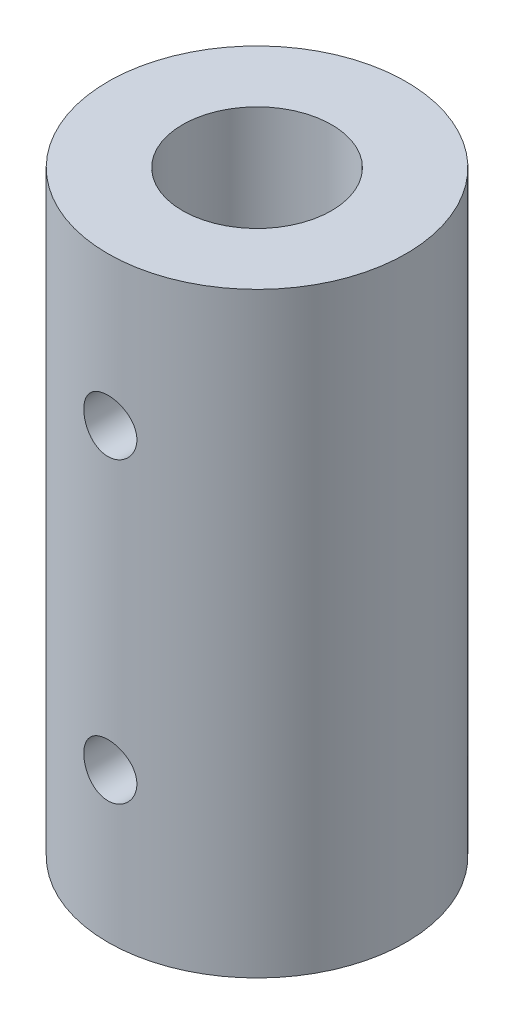
ISO-10303-21;
HEADER;
FILE_DESCRIPTION(('STEP AP214'),'2;1');
FILE_NAME('part.step','',(''),(''),'','','');
FILE_SCHEMA(('AUTOMOTIVE_DESIGN { 1 0 10303 214 1 1 1 1 }'));
ENDSEC;
DATA;
#1=APPLICATION_CONTEXT('core data for automotive mechanical design processes');
#2=APPLICATION_PROTOCOL_DEFINITION('international standard','automotive_design',2000,#1);
#3=PRODUCT_CONTEXT('',#1,'mechanical');
#4=PRODUCT('Part','Part','',(#3));
#5=PRODUCT_RELATED_PRODUCT_CATEGORY('part','',(#4));
#6=PRODUCT_DEFINITION_FORMATION('','',#4);
#7=PRODUCT_DEFINITION_CONTEXT('part definition',#1,'design');
#8=PRODUCT_DEFINITION('design','',#6,#7);
#9=PRODUCT_DEFINITION_SHAPE('','',#8);
#10=(LENGTH_UNIT() NAMED_UNIT(*) SI_UNIT(.MILLI.,.METRE.));
#11=(NAMED_UNIT(*) PLANE_ANGLE_UNIT() SI_UNIT($,.RADIAN.));
#12=(NAMED_UNIT(*) SI_UNIT($,.STERADIAN.) SOLID_ANGLE_UNIT());
#13=UNCERTAINTY_MEASURE_WITH_UNIT(LENGTH_MEASURE(1.E-05),#10,'distance_accuracy_value','');
#14=(GEOMETRIC_REPRESENTATION_CONTEXT(3) GLOBAL_UNCERTAINTY_ASSIGNED_CONTEXT((#13)) GLOBAL_UNIT_ASSIGNED_CONTEXT((#10,
#11,#12)) REPRESENTATION_CONTEXT('',''));
#15=CARTESIAN_POINT('',(0.,0.,0.));
#16=DIRECTION('',(0.,0.,1.));
#17=DIRECTION('',(1.,0.,0.));
#18=AXIS2_PLACEMENT_3D('',#15,#16,#17);
#19=CARTESIAN_POINT('',(0.,25.4,0.));
#20=DIRECTION('',(0.,-1.,0.));
#21=DIRECTION('',(0.,0.,-1.));
#22=AXIS2_PLACEMENT_3D('',#19,#20,#21);
#23=CYLINDRICAL_SURFACE('',#22,6.35);
#24=CARTESIAN_POINT('',(1.1303,6.35,6.2485935945619));
#25=CARTESIAN_POINT('',(1.13029752860319,6.2870525183395,6.24859477928636));
#26=CARTESIAN_POINT('',(1.12502376655344,6.22407227330112,6.24955510147455));
#27=CARTESIAN_POINT('',(1.10407989662448,6.09988354255093,6.253288450742));
#28=CARTESIAN_POINT('',(1.08840060868597,6.03867667116861,6.25606307842284));
#29=CARTESIAN_POINT('',(1.04713896619609,5.91984973602094,6.26310106017997));
#30=CARTESIAN_POINT('',(1.02156538976729,5.86222654529929,6.26736309431536));
#31=CARTESIAN_POINT('',(0.96126373679034,5.75209347666385,6.27689410394911));
#32=CARTESIAN_POINT('',(0.926536522350176,5.69958311785074,6.28216298460781));
#33=CARTESIAN_POINT('',(0.848497662550808,5.6005717498314,6.29318010060458));
#34=CARTESIAN_POINT('',(0.805103209146814,5.55413647593742,6.29893262327816));
#35=CARTESIAN_POINT('',(0.711140656114696,5.46916530998382,6.31023089151142));
#36=CARTESIAN_POINT('',(0.660572107820283,5.43062991234953,6.31577662411107));
#37=CARTESIAN_POINT('',(0.553267727306874,5.36230286430117,6.3260821366722));
#38=CARTESIAN_POINT('',(0.496492076393626,5.33257282461593,6.33083628120179));
#39=CARTESIAN_POINT('',(0.378653475620942,5.28309691774555,6.33897509325521));
#40=CARTESIAN_POINT('',(0.317590843835828,5.2633503107252,6.34235986225469));
#41=CARTESIAN_POINT('',(0.193591929496426,5.23460405309039,6.34734827608291));
#42=CARTESIAN_POINT('',(0.13068204924793,5.22549374691627,6.34897024782024));
#43=CARTESIAN_POINT('',(0.00420718696587988,5.2179342391547,6.35031338922828));
#44=CARTESIAN_POINT('',(-0.0593577441923804,5.21948421576273,6.35003470542113));
#45=CARTESIAN_POINT('',(-0.18458054378409,5.2331157377211,6.34762234490442));
#46=CARTESIAN_POINT('',(-0.246251841595397,5.24507816423465,6.34550965008509));
#47=CARTESIAN_POINT('',(-0.366697607884811,5.27900700921257,6.33969011077832));
#48=CARTESIAN_POINT('',(-0.425471978630507,5.30097376493313,6.33598321254887));
#49=CARTESIAN_POINT('',(-0.538805120450371,5.354403496573,6.32735638635074));
#50=CARTESIAN_POINT('',(-0.593340631871784,5.38591477709018,6.32243031191731));
#51=CARTESIAN_POINT('',(-0.696394590932213,5.45750357504179,6.31191110570192));
#52=CARTESIAN_POINT('',(-0.744912484459764,5.49758188041694,6.30631791258354));
#53=CARTESIAN_POINT('',(-0.835258832297389,5.58582549591924,6.29499388871477));
#54=CARTESIAN_POINT('',(-0.87698549929935,5.63409497698476,6.28926222422367));
#55=CARTESIAN_POINT('',(-0.951765111250201,5.73700187966177,6.27838159660169));
#56=CARTESIAN_POINT('',(-0.984817952788778,5.79163937718225,6.27323264041835));
#57=CARTESIAN_POINT('',(-1.04133641697596,5.90585833532523,6.26409955120621));
#58=CARTESIAN_POINT('',(-1.06478844399584,5.9654466642176,6.26011707226906));
#59=CARTESIAN_POINT('',(-1.10132048259893,6.08780417395915,6.25379407198502));
#60=CARTESIAN_POINT('',(-1.11440154509545,6.15057303183217,6.25145338427448));
#61=CARTESIAN_POINT('',(-1.12967421074342,6.27659531523448,6.24871157429963));
#62=CARTESIAN_POINT('',(-1.13201151497741,6.33983053594034,6.24828450262102));
#63=CARTESIAN_POINT('',(-1.12611980656729,6.46578809255939,6.24934899119854));
#64=CARTESIAN_POINT('',(-1.11789126229031,6.52851045108291,6.25084046640858));
#65=CARTESIAN_POINT('',(-1.09122611970099,6.6511904521999,6.25554991782972));
#66=CARTESIAN_POINT('',(-1.07286485766721,6.71116500250525,6.25875514695102));
#67=CARTESIAN_POINT('',(-1.02653498701514,6.82718614840897,6.26652011136834));
#68=CARTESIAN_POINT('',(-0.998565732092793,6.88323247946106,6.27107993778172));
#69=CARTESIAN_POINT('',(-0.933474479097983,6.99045121273172,6.28109997867828));
#70=CARTESIAN_POINT('',(-0.896259814835749,7.04156650954064,6.28656911125703));
#71=CARTESIAN_POINT('',(-0.81386013074054,7.13687934061381,6.29776598333192));
#72=CARTESIAN_POINT('',(-0.768674468015055,7.18107631634506,6.30349374365968));
#73=CARTESIAN_POINT('',(-0.670967135208996,7.26183646639697,6.3146452745759));
#74=CARTESIAN_POINT('',(-0.618364201269166,7.29830203422889,6.3200645909399));
#75=CARTESIAN_POINT('',(-0.50769408739231,7.36187782756255,6.32991535892806));
#76=CARTESIAN_POINT('',(-0.449627102767371,7.38898838729681,6.33434684584306));
#77=CARTESIAN_POINT('',(-0.329956377996445,7.43293575287451,6.34170339516869));
#78=CARTESIAN_POINT('',(-0.26837124516651,7.44982196392123,6.34463569095833));
#79=CARTESIAN_POINT('',(-0.143182328625896,7.47299966996186,6.34869419748068));
#80=CARTESIAN_POINT('',(-0.0795787360337629,7.47929216499393,6.34982057868977));
#81=CARTESIAN_POINT('',(0.0469027850895835,7.4810718325168,6.35013741439244));
#82=CARTESIAN_POINT('',(0.109778614269503,7.47670692886161,6.3493543717336));
#83=CARTESIAN_POINT('',(0.233886077679077,7.45761778780555,6.34599495704242));
#84=CARTESIAN_POINT('',(0.295117724437981,7.44289362936913,6.34341859867981));
#85=CARTESIAN_POINT('',(0.414130647219048,7.40356371098143,6.3367614767518));
#86=CARTESIAN_POINT('',(0.471916767035405,7.3789722178287,6.33268288590209));
#87=CARTESIAN_POINT('',(0.582565157591165,7.3206227988472,6.32346454814741));
#88=CARTESIAN_POINT('',(0.635427142672249,7.28686434166981,6.31832473973479));
#89=CARTESIAN_POINT('',(0.735467702991133,7.21062288787509,6.30746821917931));
#90=CARTESIAN_POINT('',(0.782563586469946,7.1680323178113,6.3017448838471));
#91=CARTESIAN_POINT('',(0.868991600851845,7.0755601877831,6.29041003362776));
#92=CARTESIAN_POINT('',(0.908321908493054,7.02567692035629,6.2847985452783));
#93=CARTESIAN_POINT('',(0.97840270597492,6.91954710484127,6.27427269331679));
#94=CARTESIAN_POINT('',(1.00908013748217,6.86325169638491,6.26936442851344));
#95=CARTESIAN_POINT('',(1.06049430719683,6.74623936452374,6.26087346378714));
#96=CARTESIAN_POINT('',(1.08124068756143,6.68552679604775,6.25728947888211));
#97=CARTESIAN_POINT('',(1.10785061597257,6.57883931824542,6.2526226773509));
#98=CARTESIAN_POINT('',(1.116255146414,6.53349953405262,6.25112047177959));
#99=CARTESIAN_POINT('',(1.1274806794138,6.44211233779235,6.24910550811149));
#100=CARTESIAN_POINT('',(1.13030180856719,6.39606494179273,6.24859272758101));
#101=CARTESIAN_POINT('',(1.1303,6.35,6.2485935945619));
#102=B_SPLINE_CURVE_WITH_KNOTS('',3,(#24,#25,#26,#27,#28,#29,#30,#31,#32,#33,#34,#35,#36,#37,
#38,#39,#40,#41,#42,#43,#44,#45,#46,#47,#48,#49,#50,#51,#52,#53,#54,#55,#56,#57,#58,#59,#60,#61,
#62,#63,#64,#65,#66,#67,#68,#69,#70,#71,#72,#73,#74,#75,#76,#77,#78,#79,#80,#81,#82,#83,#84,#85,
#86,#87,#88,#89,#90,#91,#92,#93,#94,#95,#96,#97,#98,#99,#100,#101),.UNSPECIFIED.,.T.,.F.,(4,2,2,
2,2,2,2,2,2,2,2,2,2,2,2,2,2,2,2,2,2,2,2,2,2,2,2,2,2,2,2,2,2,2,2,2,2,2,4),(0.,0.188673929647674,
0.377514534626138,0.566187984707762,0.754843671490909,0.945396353842155,1.13596095857324,
1.32782903745418,1.5196828956175,1.70952248173694,1.89934743322769,2.08702890425,
2.27471670267543,2.46337072228334,2.65204210056539,2.84332262546284,3.03460543072443,
3.22615818062715,3.41769151757454,3.60661956640561,3.79553924064848,3.98307286921064,
4.17061911513114,4.3601268464934,4.5496498693968,4.74143924348985,4.93322176468823,
5.12407001760691,5.31490025359553,5.50309687534892,5.69129206257061,5.87921612052191,
6.06715107352078,6.25752581883365,6.44794520878686,6.63992726090084,6.83172253573716,
6.96979717232731,7.10786867825192),.UNSPECIFIED.);
#103=CARTESIAN_POINT('',(1.1303,6.35,6.2485935945619));
#104=VERTEX_POINT('',#103);
#105=EDGE_CURVE('E102',#104,#104,#102,.T.);
#106=ORIENTED_EDGE('',*,*,#105,.T.);
#107=EDGE_LOOP('',(#106));
#108=FACE_BOUND('',#107,.T.);
#109=CARTESIAN_POINT('',(1.1303,19.05,6.2485935945619));
#110=CARTESIAN_POINT('',(1.13029752860319,18.9870525183395,6.24859477928636));
#111=CARTESIAN_POINT('',(1.12502376655344,18.9240722733011,6.24955510147455));
#112=CARTESIAN_POINT('',(1.10407989662448,18.7998835425509,6.253288450742));
#113=CARTESIAN_POINT('',(1.08840060868598,18.7386766711686,6.25606307842284));
#114=CARTESIAN_POINT('',(1.04713896619609,18.6198497360209,6.26310106017997));
#115=CARTESIAN_POINT('',(1.02156538976729,18.5622265452993,6.26736309431536));
#116=CARTESIAN_POINT('',(0.961263736790341,18.4520934766638,6.27689410394911));
#117=CARTESIAN_POINT('',(0.926536522350177,18.3995831178507,6.2821629846078));
#118=CARTESIAN_POINT('',(0.848497662550809,18.3005717498314,6.29318010060458));
#119=CARTESIAN_POINT('',(0.805103209146815,18.2541364759374,6.29893262327816));
#120=CARTESIAN_POINT('',(0.711140656114698,18.1691653099838,6.31023089151142));
#121=CARTESIAN_POINT('',(0.660572107820285,18.1306299123495,6.31577662411107));
#122=CARTESIAN_POINT('',(0.553267727306876,18.0623028643012,6.3260821366722));
#123=CARTESIAN_POINT('',(0.496492076393627,18.0325728246159,6.33083628120179));
#124=CARTESIAN_POINT('',(0.378653475620944,17.9830969177455,6.33897509325521));
#125=CARTESIAN_POINT('',(0.317590843835831,17.9633503107252,6.34235986225469));
#126=CARTESIAN_POINT('',(0.193591929496429,17.9346040530904,6.34734827608291));
#127=CARTESIAN_POINT('',(0.130682049247933,17.9254937469163,6.34897024782024));
#128=CARTESIAN_POINT('',(0.00420718696588254,17.9179342391547,6.35031338922828));
#129=CARTESIAN_POINT('',(-0.0593577441923779,17.9194842157627,6.35003470542113));
#130=CARTESIAN_POINT('',(-0.184580543784088,17.9331157377211,6.34762234490442));
#131=CARTESIAN_POINT('',(-0.246251841595395,17.9450781642347,6.34550965008509));
#132=CARTESIAN_POINT('',(-0.36669760788481,17.9790070092126,6.33969011077832));
#133=CARTESIAN_POINT('',(-0.425471978630506,18.0009737649331,6.33598321254887));
#134=CARTESIAN_POINT('',(-0.53880512045037,18.054403496573,6.32735638635074));
#135=CARTESIAN_POINT('',(-0.593340631871781,18.0859147770902,6.32243031191731));
#136=CARTESIAN_POINT('',(-0.696394590932211,18.1575035750418,6.31191110570192));
#137=CARTESIAN_POINT('',(-0.744912484459763,18.1975818804169,6.30631791258354));
#138=CARTESIAN_POINT('',(-0.835258832297389,18.2858254959192,6.29499388871477));
#139=CARTESIAN_POINT('',(-0.87698549929935,18.3340949769848,6.28926222422367));
#140=CARTESIAN_POINT('',(-0.951765111250202,18.4370018796618,6.27838159660169));
#141=CARTESIAN_POINT('',(-0.984817952788779,18.4916393771822,6.27323264041835));
#142=CARTESIAN_POINT('',(-1.04133641697596,18.6058583353252,6.26409955120621));
#143=CARTESIAN_POINT('',(-1.06478844399584,18.6654466642176,6.26011707226906));
#144=CARTESIAN_POINT('',(-1.10132048259893,18.7878041739592,6.25379407198502));
#145=CARTESIAN_POINT('',(-1.11440154509545,18.8505730318322,6.25145338427448));
#146=CARTESIAN_POINT('',(-1.12967421074342,18.9765953152345,6.24871157429962));
#147=CARTESIAN_POINT('',(-1.13201151497741,19.0398305359403,6.24828450262101));
#148=CARTESIAN_POINT('',(-1.12611980656729,19.1657880925594,6.24934899119854));
#149=CARTESIAN_POINT('',(-1.11789126229031,19.2285104510829,6.25084046640858));
#150=CARTESIAN_POINT('',(-1.09122611970099,19.3511904521999,6.25554991782972));
#151=CARTESIAN_POINT('',(-1.07286485766721,19.4111650025052,6.25875514695102));
#152=CARTESIAN_POINT('',(-1.02653498701515,19.527186148409,6.26652011136834));
#153=CARTESIAN_POINT('',(-0.998565732092795,19.583232479461,6.27107993778172));
#154=CARTESIAN_POINT('',(-0.933474479097985,19.6904512127317,6.28109997867828));
#155=CARTESIAN_POINT('',(-0.896259814835751,19.7415665095406,6.28656911125702));
#156=CARTESIAN_POINT('',(-0.813860130740543,19.8368793406138,6.29776598333192));
#157=CARTESIAN_POINT('',(-0.768674468015057,19.8810763163451,6.30349374365968));
#158=CARTESIAN_POINT('',(-0.670967135208999,19.961836466397,6.3146452745759));
#159=CARTESIAN_POINT('',(-0.618364201269168,19.9983020342289,6.32006459093989));
#160=CARTESIAN_POINT('',(-0.507694087392312,20.0618778275625,6.32991535892806));
#161=CARTESIAN_POINT('',(-0.449627102767373,20.0889883872968,6.33434684584306));
#162=CARTESIAN_POINT('',(-0.329956377996447,20.1329357528745,6.34170339516869));
#163=CARTESIAN_POINT('',(-0.268371245166512,20.1498219639212,6.34463569095833));
#164=CARTESIAN_POINT('',(-0.143182328625899,20.1729996699619,6.34869419748068));
#165=CARTESIAN_POINT('',(-0.0795787360337656,20.1792921649939,6.34982057868977));
#166=CARTESIAN_POINT('',(0.0469027850895804,20.1810718325168,6.35013741439244));
#167=CARTESIAN_POINT('',(0.1097786142695,20.1767069288616,6.3493543717336));
#168=CARTESIAN_POINT('',(0.233886077679074,20.1576177878055,6.34599495704242));
#169=CARTESIAN_POINT('',(0.295117724437978,20.1428936293691,6.34341859867981));
#170=CARTESIAN_POINT('',(0.414130647219046,20.1035637109814,6.3367614767518));
#171=CARTESIAN_POINT('',(0.471916767035404,20.0789722178287,6.33268288590209));
#172=CARTESIAN_POINT('',(0.582565157591164,20.0206227988472,6.32346454814741));
#173=CARTESIAN_POINT('',(0.635427142672247,19.9868643416698,6.31832473973479));
#174=CARTESIAN_POINT('',(0.735467702991131,19.9106228878751,6.30746821917931));
#175=CARTESIAN_POINT('',(0.782563586469944,19.8680323178113,6.3017448838471));
#176=CARTESIAN_POINT('',(0.868991600851844,19.7755601877831,6.29041003362776));
#177=CARTESIAN_POINT('',(0.908321908493052,19.7256769203563,6.2847985452783));
#178=CARTESIAN_POINT('',(0.978402705974919,19.6195471048413,6.27427269331679));
#179=CARTESIAN_POINT('',(1.00908013748217,19.5632516963849,6.26936442851344));
#180=CARTESIAN_POINT('',(1.06049430719683,19.4462393645237,6.26087346378714));
#181=CARTESIAN_POINT('',(1.08124068756143,19.3855267960477,6.25728947888211));
#182=CARTESIAN_POINT('',(1.10785061597257,19.2788393182454,6.2526226773509));
#183=CARTESIAN_POINT('',(1.116255146414,19.2334995340526,6.25112047177959));
#184=CARTESIAN_POINT('',(1.1274806794138,19.1421123377923,6.24910550811149));
#185=CARTESIAN_POINT('',(1.13030180856719,19.0960649417927,6.24859272758101));
#186=CARTESIAN_POINT('',(1.1303,19.05,6.2485935945619));
#187=B_SPLINE_CURVE_WITH_KNOTS('',3,(#109,#110,#111,#112,#113,#114,#115,#116,#117,#118,#119,
#120,#121,#122,#123,#124,#125,#126,#127,#128,#129,#130,#131,#132,#133,#134,#135,#136,#137,#138,
#139,#140,#141,#142,#143,#144,#145,#146,#147,#148,#149,#150,#151,#152,#153,#154,#155,#156,#157,
#158,#159,#160,#161,#162,#163,#164,#165,#166,#167,#168,#169,#170,#171,#172,#173,#174,#175,#176,
#177,#178,#179,#180,#181,#182,#183,#184,#185,#186),.UNSPECIFIED.,.T.,.F.,(4,2,2,2,2,2,2,2,2,2,2,
2,2,2,2,2,2,2,2,2,2,2,2,2,2,2,2,2,2,2,2,2,2,2,2,2,2,2,4),(0.,0.188673929647675,
0.377514534626136,0.566187984707764,0.754843671490909,0.945396353842153,1.13596095857323,
1.32782903745418,1.51968289561749,1.70952248173694,1.89934743322768,2.08702890424999,
2.27471670267543,2.46337072228334,2.65204210056539,2.84332262546284,3.03460543072443,
3.22615818062715,3.41769151757454,3.60661956640561,3.79553924064848,3.98307286921064,
4.17061911513114,4.3601268464934,4.5496498693968,4.74143924348985,4.93322176468823,
5.12407001760691,5.31490025359552,5.50309687534892,5.69129206257061,5.87921612052191,
6.06715107352078,6.25752581883365,6.44794520878686,6.63992726090084,6.83172253573716,
6.96979717232731,7.10786867825193),.UNSPECIFIED.);
#188=CARTESIAN_POINT('',(1.1303,19.05,6.2485935945619));
#189=VERTEX_POINT('',#188);
#190=EDGE_CURVE('E10',#189,#189,#187,.T.);
#191=ORIENTED_EDGE('',*,*,#190,.T.);
#192=EDGE_LOOP('',(#191));
#193=FACE_BOUND('',#192,.T.);
#194=CARTESIAN_POINT('',(0.,25.4,0.));
#195=DIRECTION('',(0.,1.,0.));
#196=DIRECTION('',(0.,0.,1.));
#197=AXIS2_PLACEMENT_3D('',#194,#195,#196);
#198=CIRCLE('',#197,6.35);
#199=CARTESIAN_POINT('',(0.,25.4,6.35));
#200=VERTEX_POINT('',#199);
#201=EDGE_CURVE('E51',#200,#200,#198,.T.);
#202=ORIENTED_EDGE('',*,*,#201,.F.);
#203=EDGE_LOOP('',(#202));
#204=FACE_BOUND('',#203,.T.);
#205=CARTESIAN_POINT('',(0.,0.,0.));
#206=DIRECTION('',(0.,1.,0.));
#207=DIRECTION('',(0.,0.,1.));
#208=AXIS2_PLACEMENT_3D('',#205,#206,#207);
#209=CIRCLE('',#208,6.35);
#210=CARTESIAN_POINT('',(0.,0.,6.35));
#211=VERTEX_POINT('',#210);
#212=EDGE_CURVE('E56',#211,#211,#209,.T.);
#213=ORIENTED_EDGE('',*,*,#212,.T.);
#214=EDGE_LOOP('',(#213));
#215=FACE_BOUND('',#214,.T.);
#216=ADVANCED_FACE('F37',(#108,#193,#204,#215),#23,.T.);
#217=CARTESIAN_POINT('',(0.,25.4,0.));
#218=DIRECTION('',(0.,1.,0.));
#219=DIRECTION('',(0.,0.,1.));
#220=AXIS2_PLACEMENT_3D('',#217,#218,#219);
#221=PLANE('',#220);
#222=CARTESIAN_POINT('',(0.,25.4,0.));
#223=DIRECTION('',(0.,1.,0.));
#224=DIRECTION('',(0.,0.,1.));
#225=AXIS2_PLACEMENT_3D('',#222,#223,#224);
#226=CIRCLE('',#225,3.175);
#227=CARTESIAN_POINT('',(0.,25.4,3.175));
#228=VERTEX_POINT('',#227);
#229=EDGE_CURVE('E123',#228,#228,#226,.T.);
#230=ORIENTED_EDGE('',*,*,#229,.F.);
#231=EDGE_LOOP('',(#230));
#232=FACE_BOUND('',#231,.T.);
#233=ORIENTED_EDGE('',*,*,#201,.T.);
#234=EDGE_LOOP('',(#233));
#235=FACE_BOUND('',#234,.T.);
#236=ADVANCED_FACE('F87',(#232,#235),#221,.T.);
#237=CARTESIAN_POINT('',(0.,0.,0.));
#238=DIRECTION('',(0.,1.,0.));
#239=DIRECTION('',(0.,0.,1.));
#240=AXIS2_PLACEMENT_3D('',#237,#238,#239);
#241=PLANE('',#240);
#242=CARTESIAN_POINT('',(0.,0.,0.));
#243=DIRECTION('',(0.,-1.,0.));
#244=DIRECTION('',(0.,0.,-1.));
#245=AXIS2_PLACEMENT_3D('',#242,#243,#244);
#246=CIRCLE('',#245,4.0005);
#247=CARTESIAN_POINT('',(0.,0.,-4.0005));
#248=VERTEX_POINT('',#247);
#249=EDGE_CURVE('E112',#248,#248,#246,.T.);
#250=ORIENTED_EDGE('',*,*,#249,.F.);
#251=EDGE_LOOP('',(#250));
#252=FACE_BOUND('',#251,.T.);
#253=ORIENTED_EDGE('',*,*,#212,.F.);
#254=EDGE_LOOP('',(#253));
#255=FACE_BOUND('',#254,.T.);
#256=ADVANCED_FACE('F82',(#252,#255),#241,.F.);
#257=CARTESIAN_POINT('',(0.,12.7,0.));
#258=DIRECTION('',(0.,-1.,0.));
#259=DIRECTION('',(0.,0.,-1.));
#260=AXIS2_PLACEMENT_3D('',#257,#258,#259);
#261=CYLINDRICAL_SURFACE('',#260,4.0005);
#262=CARTESIAN_POINT('',(1.1303,6.35,3.83750207296361));
#263=CARTESIAN_POINT('',(1.13029881146711,6.41211407632587,3.83750298391038));
#264=CARTESIAN_POINT('',(1.12516247499522,6.47424024969502,3.83902664421412));
#265=CARTESIAN_POINT('',(1.10479817143099,6.59668815040803,3.84493564827521));
#266=CARTESIAN_POINT('',(1.08956593803019,6.65700910363713,3.84932220181755));
#267=CARTESIAN_POINT('',(1.04955880119953,6.77405704732668,3.8604213971392));
#268=CARTESIAN_POINT('',(1.02479844005085,6.83078936203822,3.8671304925856));
#269=CARTESIAN_POINT('',(0.966484564083541,6.93930612801753,3.88211418010889));
#270=CARTESIAN_POINT('',(0.93293006570939,6.99109002495886,3.89038894726512));
#271=CARTESIAN_POINT('',(0.85697259681822,7.08969353473934,3.90783201780921));
#272=CARTESIAN_POINT('',(0.814366554860046,7.13635367959593,3.91701767636674));
#273=CARTESIAN_POINT('',(0.721951459487022,7.22197057064099,3.93509846888052));
#274=CARTESIAN_POINT('',(0.672141580889583,7.26092643311008,3.94399356941074));
#275=CARTESIAN_POINT('',(0.565613685423207,7.3307065971395,3.96068628948753));
#276=CARTESIAN_POINT('',(0.508786696481947,7.36137048194192,3.9684610601047));
#277=CARTESIAN_POINT('',(0.390526654493352,7.41264684140982,3.98183682738919));
#278=CARTESIAN_POINT('',(0.329094480082406,7.43326122784463,3.987438237465));
#279=CARTESIAN_POINT('',(0.205034263863408,7.46333194723373,3.99571340394489));
#280=CARTESIAN_POINT('',(0.14247691147827,7.47305998575789,3.99845832474132));
#281=CARTESIAN_POINT('',(0.0165618749246993,7.4819386894115,4.00096088327303));
#282=CARTESIAN_POINT('',(-0.0467956573022951,7.48109133334832,4.00071907986716));
#283=CARTESIAN_POINT('',(-0.170614498677898,7.46903050302831,3.9973267295327));
#284=CARTESIAN_POINT('',(-0.231107040631201,7.45811088550299,3.99425864233504));
#285=CARTESIAN_POINT('',(-0.349363267106376,7.42669267132765,3.98565709797974));
#286=CARTESIAN_POINT('',(-0.407126786988941,7.40619349756258,3.98012349228924));
#287=CARTESIAN_POINT('',(-0.519011431724134,7.35598515804789,3.96709422404738));
#288=CARTESIAN_POINT('',(-0.573086622331159,7.32617916858694,3.95957806993112));
#289=CARTESIAN_POINT('',(-0.675565182606442,7.25827858651996,3.9433878082856));
#290=CARTESIAN_POINT('',(-0.723967328847994,7.22018221108326,3.93471345184259));
#291=CARTESIAN_POINT('',(-0.815480217263496,7.1352385845268,3.9167899024772));
#292=CARTESIAN_POINT('',(-0.85835213196266,7.08813572223461,3.90753119888498));
#293=CARTESIAN_POINT('',(-0.935650931305264,6.98731524708871,3.8897474295998));
#294=CARTESIAN_POINT('',(-0.970077161782747,6.93359712232925,3.88122242076884));
#295=CARTESIAN_POINT('',(-1.02971956978015,6.82050230779887,3.86582954464471));
#296=CARTESIAN_POINT('',(-1.05486321729813,6.76108544472338,3.85897486410862));
#297=CARTESIAN_POINT('',(-1.09472245738957,6.63862434419799,3.84785862560608));
#298=CARTESIAN_POINT('',(-1.10944100618285,6.57558114054761,3.84359633257111));
#299=CARTESIAN_POINT('',(-1.12760462003759,6.44990898515151,3.83830629141133));
#300=CARTESIAN_POINT('',(-1.13140909822249,6.38733626722491,3.83717546551162));
#301=CARTESIAN_POINT('',(-1.12863308134295,6.26244713371915,3.83799296068869));
#302=CARTESIAN_POINT('',(-1.12205384842732,6.20013068791299,3.83994090753809));
#303=CARTESIAN_POINT('',(-1.09901559356887,6.07895989168085,3.84659613935838));
#304=CARTESIAN_POINT('',(-1.08277966173505,6.02005935964853,3.85124106255429));
#305=CARTESIAN_POINT('',(-1.04114331842067,5.90581950334713,3.86270424307277));
#306=CARTESIAN_POINT('',(-1.01574160534212,5.85048068617959,3.86952280905011));
#307=CARTESIAN_POINT('',(-0.955787485565368,5.74345078829606,3.88477112527686));
#308=CARTESIAN_POINT('',(-0.921027883247859,5.69188089111522,3.89323597404496));
#309=CARTESIAN_POINT('',(-0.843596459725415,5.59517420945369,3.91074390338757));
#310=CARTESIAN_POINT('',(-0.800922962559379,5.5500387912193,3.91978710617645));
#311=CARTESIAN_POINT('',(-0.707199886252196,5.46595351500849,3.93779321935515));
#312=CARTESIAN_POINT('',(-0.655920774084995,5.4272562639596,3.9467436814507));
#313=CARTESIAN_POINT('',(-0.547389016030667,5.35901493886885,3.9632529399234));
#314=CARTESIAN_POINT('',(-0.49013668464065,5.32947038325146,3.97081180951166));
#315=CARTESIAN_POINT('',(-0.371682223757537,5.28065383278583,3.98363785328489));
#316=CARTESIAN_POINT('',(-0.310514097350031,5.26130409461047,3.98892231316729));
#317=CARTESIAN_POINT('',(-0.185620640105778,5.23321122317832,3.99668043962595));
#318=CARTESIAN_POINT('',(-0.121895955493672,5.22446542678348,3.9991548119347));
#319=CARTESIAN_POINT('',(0.00395403144937136,5.21801229838289,4.00097614785141));
#320=CARTESIAN_POINT('',(0.0660591797110015,5.21993648045075,4.00042751468783));
#321=CARTESIAN_POINT('',(0.189025329725492,5.23390140316533,3.99650520312081));
#322=CARTESIAN_POINT('',(0.249886388644993,5.24594167789637,3.99313165482416));
#323=CARTESIAN_POINT('',(0.36813631070084,5.27957894526055,3.98396362726557));
#324=CARTESIAN_POINT('',(0.425550462683753,5.30109314423206,3.97819014525728));
#325=CARTESIAN_POINT('',(0.535986132882073,5.35299392119548,3.96482240522868));
#326=CARTESIAN_POINT('',(0.589006979510236,5.38338185247943,3.95722786951948));
#327=CARTESIAN_POINT('',(0.690832985807685,5.45320053798439,3.94074737868197));
#328=CARTESIAN_POINT('',(0.739469632822508,5.4928696382603,3.93183016553073));
#329=CARTESIAN_POINT('',(0.829519913523745,5.57968323076758,3.91382294978893));
#330=CARTESIAN_POINT('',(0.870931562554414,5.62682977023022,3.90473290047956));
#331=CARTESIAN_POINT('',(0.946410145165625,5.72870602405084,3.88713922682954));
#332=CARTESIAN_POINT('',(0.980262671433599,5.78359855588273,3.87865648813337));
#333=CARTESIAN_POINT('',(1.03821377883186,5.8985285714632,3.86354951714337));
#334=CARTESIAN_POINT('',(1.06231798067148,5.95856306617968,3.85692421456316));
#335=CARTESIAN_POINT('',(1.09738110688922,6.07353669568122,3.84708178481228));
#336=CARTESIAN_POINT('',(1.10969446827572,6.12803670130415,3.84352064059059));
#337=CARTESIAN_POINT('',(1.12615383817329,6.23835467944684,3.83873054969922));
#338=CARTESIAN_POINT('',(1.13030106824216,6.29417245357946,3.83750125421323));
#339=CARTESIAN_POINT('',(1.1303,6.35,3.83750207296361));
#340=B_SPLINE_CURVE_WITH_KNOTS('',3,(#262,#263,#264,#265,#266,#267,#268,#269,#270,#271,#272,
#273,#274,#275,#276,#277,#278,#279,#280,#281,#282,#283,#284,#285,#286,#287,#288,#289,#290,#291,
#292,#293,#294,#295,#296,#297,#298,#299,#300,#301,#302,#303,#304,#305,#306,#307,#308,#309,#310,
#311,#312,#313,#314,#315,#316,#317,#318,#319,#320,#321,#322,#323,#324,#325,#326,#327,#328,#329,
#330,#331,#332,#333,#334,#335,#336,#337,#338,#339),.UNSPECIFIED.,.T.,.F.,(4,2,2,2,2,2,2,2,2,2,2,
2,2,2,2,2,2,2,2,2,2,2,2,2,2,2,2,2,2,2,2,2,2,2,2,2,2,2,4),(0.,0.186136649711366,0.3723520069517,
0.558284273539473,0.744237344078945,0.934912796678942,1.12561010802913,1.31976849546699,
1.51388993269865,1.70305013737494,1.89217494800603,2.07595085082222,2.25973782654325,
2.44550439458103,2.63131095088863,2.82349903435625,3.01570199918013,3.20937646922867,
3.40299599746907,3.59016183724683,3.77730492861181,3.96028394505988,4.14328895590014,
4.33073713320995,4.51822505268851,4.71188638149438,4.9055375189413,5.097689724567,
5.28979366192306,5.47530556436878,5.66080892318328,5.84472236065289,6.0286638605749,
6.21798165596766,6.40735137401758,6.60155380713302,6.79564410641358,6.96296700442023,
7.13026487097478),.UNSPECIFIED.);
#341=CARTESIAN_POINT('',(1.1303,6.35,3.83750207296361));
#342=VERTEX_POINT('',#341);
#343=EDGE_CURVE('E62',#342,#342,#340,.T.);
#344=ORIENTED_EDGE('',*,*,#343,.T.);
#345=EDGE_LOOP('',(#344));
#346=FACE_BOUND('',#345,.T.);
#347=CARTESIAN_POINT('',(0.,12.7,0.));
#348=DIRECTION('',(0.,-1.,0.));
#349=DIRECTION('',(0.,0.,-1.));
#350=AXIS2_PLACEMENT_3D('',#347,#348,#349);
#351=CIRCLE('',#350,4.0005);
#352=CARTESIAN_POINT('',(0.,12.7,-4.0005));
#353=VERTEX_POINT('',#352);
#354=EDGE_CURVE('E109',#353,#353,#351,.T.);
#355=ORIENTED_EDGE('',*,*,#354,.F.);
#356=EDGE_LOOP('',(#355));
#357=FACE_BOUND('',#356,.T.);
#358=ORIENTED_EDGE('',*,*,#249,.T.);
#359=EDGE_LOOP('',(#358));
#360=FACE_BOUND('',#359,.T.);
#361=ADVANCED_FACE('F76',(#346,#357,#360),#261,.F.);
#362=CARTESIAN_POINT('',(0.,12.7,0.));
#363=DIRECTION('',(0.,-1.,0.));
#364=DIRECTION('',(0.,0.,-1.));
#365=AXIS2_PLACEMENT_3D('',#362,#363,#364);
#366=PLANE('',#365);
#367=CARTESIAN_POINT('',(0.,12.7,0.));
#368=DIRECTION('',(0.,1.,0.));
#369=DIRECTION('',(0.,0.,1.));
#370=AXIS2_PLACEMENT_3D('',#367,#368,#369);
#371=CIRCLE('',#370,3.175);
#372=CARTESIAN_POINT('',(0.,12.7,3.175));
#373=VERTEX_POINT('',#372);
#374=EDGE_CURVE('E127',#373,#373,#371,.T.);
#375=ORIENTED_EDGE('',*,*,#374,.T.);
#376=EDGE_LOOP('',(#375));
#377=FACE_BOUND('',#376,.T.);
#378=ORIENTED_EDGE('',*,*,#354,.T.);
#379=EDGE_LOOP('',(#378));
#380=FACE_BOUND('',#379,.T.);
#381=ADVANCED_FACE('F81',(#377,#380),#366,.T.);
#382=CARTESIAN_POINT('',(0.,6.35,0.));
#383=DIRECTION('',(0.,0.,1.));
#384=DIRECTION('',(1.,0.,0.));
#385=AXIS2_PLACEMENT_3D('',#382,#383,#384);
#386=CYLINDRICAL_SURFACE('',#385,1.1303);
#387=ORIENTED_EDGE('',*,*,#343,.F.);
#388=EDGE_LOOP('',(#387));
#389=FACE_BOUND('',#388,.T.);
#390=ORIENTED_EDGE('',*,*,#105,.F.);
#391=EDGE_LOOP('',(#390));
#392=FACE_BOUND('',#391,.T.);
#393=ADVANCED_FACE('F73',(#389,#392),#386,.F.);
#394=CARTESIAN_POINT('',(0.,19.05,0.));
#395=DIRECTION('',(0.,0.,1.));
#396=DIRECTION('',(1.,0.,0.));
#397=AXIS2_PLACEMENT_3D('',#394,#395,#396);
#398=CYLINDRICAL_SURFACE('',#397,1.1303);
#399=CARTESIAN_POINT('',(1.1303,19.05,2.96699290696827));
#400=CARTESIAN_POINT('',(1.13030126949561,18.9887110406615,2.96699180092178));
#401=CARTESIAN_POINT('',(1.12529831217773,18.9274308726543,2.96891266523162));
#402=CARTESIAN_POINT('',(1.10549852105486,18.8067032380783,2.976341367105));
#403=CARTESIAN_POINT('',(1.09070115134954,18.7472558719774,2.9818494009399));
#404=CARTESIAN_POINT('',(1.05191211633808,18.6319662475179,2.9957511550193));
#405=CARTESIAN_POINT('',(1.02794056093624,18.5761164139814,3.00413855954278));
#406=CARTESIAN_POINT('',(0.971553767874791,18.4692107503721,3.02284430324832));
#407=CARTESIAN_POINT('',(0.939136285382004,18.4181561997475,3.03316315558203));
#408=CARTESIAN_POINT('',(0.865225378101707,18.3200077931434,3.05508626986901));
#409=CARTESIAN_POINT('',(0.823416737479141,18.2731591093842,3.06672572194972));
#410=CARTESIAN_POINT('',(0.732580946565031,18.186967856637,3.08968323184446));
#411=CARTESIAN_POINT('',(0.683552447130752,18.1476266937074,3.1010012291171));
#412=CARTESIAN_POINT('',(0.577839731348626,18.0764187200041,3.1224537652803));
#413=CARTESIAN_POINT('',(0.520968849300919,18.0448138911978,3.13254217002369));
#414=CARTESIAN_POINT('',(0.402295832054577,17.991719440706,3.14997980235623));
#415=CARTESIAN_POINT('',(0.340495233260629,17.9702266817679,3.15732987935941));
#416=CARTESIAN_POINT('',(0.216291429363961,17.9388129001187,3.16821317131574));
#417=CARTESIAN_POINT('',(0.154007098319548,17.9284707721896,3.17188488321263));
#418=CARTESIAN_POINT('',(0.028485990440722,17.9183073936133,3.1754922345549));
#419=CARTESIAN_POINT('',(-0.0347505016117874,17.9184830573218,3.17542896974461));
#420=CARTESIAN_POINT('',(-0.157380355815445,17.9290947425401,3.17166431166137));
#421=CARTESIAN_POINT('',(-0.216819232200466,17.9390722215322,3.16812551082658));
#422=CARTESIAN_POINT('',(-0.333116055100486,17.9682391229743,3.15801637664471));
#423=CARTESIAN_POINT('',(-0.389973821301094,17.9874291879277,3.15144583185916));
#424=CARTESIAN_POINT('',(-0.500434290449895,18.0347145890065,3.13581701279072));
#425=CARTESIAN_POINT('',(-0.553980350398551,18.0629307133355,3.12672523235359));
#426=CARTESIAN_POINT('',(-0.655704901634493,18.1273640862445,3.10698647045265));
#427=CARTESIAN_POINT('',(-0.703881757104612,18.163583763269,3.09633901729824));
#428=CARTESIAN_POINT('',(-0.796215706775618,18.2452538860666,3.07392952110036));
#429=CARTESIAN_POINT('',(-0.840022503287889,18.2910929538074,3.06213831691244));
#430=CARTESIAN_POINT('',(-0.919450536225369,18.3895526212715,3.03923485845035));
#431=CARTESIAN_POINT('',(-0.955070114455716,18.4421745914046,3.02812274204891));
#432=CARTESIAN_POINT('',(-1.01769271316585,18.5539592701495,3.00766281876103));
#433=CARTESIAN_POINT('',(-1.04452651167638,18.6132238703236,2.99835093480064));
#434=CARTESIAN_POINT('',(-1.08770687791103,18.7358479460289,2.98296002370199));
#435=CARTESIAN_POINT('',(-1.10405859416822,18.7992053943974,2.97687940969726));
#436=CARTESIAN_POINT('',(-1.12505332850273,18.9247849613907,2.96900658684162));
#437=CARTESIAN_POINT('',(-1.13024679297079,18.9869023871962,2.96701300712206));
#438=CARTESIAN_POINT('',(-1.13035235934412,19.1111397141368,2.96697312971029));
#439=CARTESIAN_POINT('',(-1.12526668272106,19.1732596118363,2.9689259791374));
#440=CARTESIAN_POINT('',(-1.10545550475944,19.2930696369474,2.97635611028255));
#441=CARTESIAN_POINT('',(-1.09113471741141,19.3508368993112,2.98168526601896));
#442=CARTESIAN_POINT('',(-1.05375787852425,19.4631295652805,2.99509779472348));
#443=CARTESIAN_POINT('',(-1.03070014678855,19.517654342991,3.00318169742524));
#444=CARTESIAN_POINT('',(-0.975593219400548,19.6240287007789,3.0215413409512));
#445=CARTESIAN_POINT('',(-0.943258091531736,19.6757183161992,3.03188377797999));
#446=CARTESIAN_POINT('',(-0.870827536052562,19.7731351589139,3.0534751542732));
#447=CARTESIAN_POINT('',(-0.830729519593917,19.8188603886049,3.0647243952155));
#448=CARTESIAN_POINT('',(-0.741245393025423,19.9057068263094,3.0876248127599));
#449=CARTESIAN_POINT('',(-0.691464443347562,19.9464258938531,3.09926313882807));
#450=CARTESIAN_POINT('',(-0.585488794794462,20.0189702537958,3.12101743586169));
#451=CARTESIAN_POINT('',(-0.529294210180944,20.0507957046036,3.13113343394066));
#452=CARTESIAN_POINT('',(-0.412253306959744,20.1043930373707,3.14867455762266));
#453=CARTESIAN_POINT('',(-0.351432796366106,20.1262165220238,3.15611345134428));
#454=CARTESIAN_POINT('',(-0.226662836118679,20.1592165707738,3.16751726579442));
#455=CARTESIAN_POINT('',(-0.162714706431159,20.1703975862936,3.17148363891749));
#456=CARTESIAN_POINT('',(-0.0371588940228268,20.1813516268051,3.17537085125336));
#457=CARTESIAN_POINT('',(0.0243929105435865,20.1816985387022,3.17549520012136));
#458=CARTESIAN_POINT('',(0.146637730412363,20.1724223276304,3.1722011158763));
#459=CARTESIAN_POINT('',(0.2073308320097,20.1628002138126,3.16878304135799));
#460=CARTESIAN_POINT('',(0.324899902225857,20.1342533231202,3.1588730580352));
#461=CARTESIAN_POINT('',(0.381828226370772,20.1155204903234,3.15244466988758));
#462=CARTESIAN_POINT('',(0.491747356923696,20.0694682532889,3.13717898355161));
#463=CARTESIAN_POINT('',(0.544737424039251,20.0421472418806,3.12834123452256));
#464=CARTESIAN_POINT('',(0.647587160628671,19.9784464342489,3.10871467602532));
#465=CARTESIAN_POINT('',(0.69723748981861,19.9417486161492,3.0978620760476));
#466=CARTESIAN_POINT('',(0.7898578088236,19.8608552527356,3.07555250387425));
#467=CARTESIAN_POINT('',(0.832825512939462,19.8166571528158,3.06409532667805));
#468=CARTESIAN_POINT('',(0.912898108309838,19.7195772860472,3.04122635424545));
#469=CARTESIAN_POINT('',(0.949639270596972,19.6663881325584,3.0298412400875));
#470=CARTESIAN_POINT('',(1.01365584279662,19.5542298478198,3.00903053343651));
#471=CARTESIAN_POINT('',(1.04093198735494,19.4952611656152,2.99960478888596));
#472=CARTESIAN_POINT('',(1.08510912643682,19.3730236422474,2.9839099977344));
#473=CARTESIAN_POINT('',(1.10199264087853,19.3097477538929,2.97764627271748));
#474=CARTESIAN_POINT('',(1.12458464442987,19.1809771582326,2.96918932171508));
#475=CARTESIAN_POINT('',(1.13029864362041,19.1154835611847,2.96699408871232));
#476=CARTESIAN_POINT('',(1.1303,19.05,2.96699290696827));
#477=B_SPLINE_CURVE_WITH_KNOTS('',3,(#399,#400,#401,#402,#403,#404,#405,#406,#407,#408,#409,
#410,#411,#412,#413,#414,#415,#416,#417,#418,#419,#420,#421,#422,#423,#424,#425,#426,#427,#428,
#429,#430,#431,#432,#433,#434,#435,#436,#437,#438,#439,#440,#441,#442,#443,#444,#445,#446,#447,
#448,#449,#450,#451,#452,#453,#454,#455,#456,#457,#458,#459,#460,#461,#462,#463,#464,#465,#466,
#467,#468,#469,#470,#471,#472,#473,#474,#475,#476),.UNSPECIFIED.,.T.,.F.,(4,2,2,2,2,2,2,2,2,2,2,
2,2,2,2,2,2,2,2,2,2,2,2,2,2,2,2,2,2,2,2,2,2,2,2,2,2,2,4),(0.,0.183623661784846,
0.367257371351086,0.550490838429556,0.73377305669074,0.924501319590956,1.11526526836209,
1.3117975652931,1.50826884814033,1.69702812609223,1.88573202729147,2.06600906280416,
2.24629867301316,2.42910965891792,2.61197618983504,2.80457310610201,2.99720899560137,
3.19336255385327,3.38941969247878,3.57555921531926,3.76165851500699,3.94011049494313,
4.11859681030486,4.30331748902537,4.48809987675376,4.68324756844095,4.87839178402888,
5.07251754238689,5.2665620680873,5.45030949868025,5.63403833058547,5.81405386702817,
5.99410311120744,6.18133819670188,6.36863718318313,6.56461137244542,6.76057034738463,
6.95685802501451,7.15304884667686),.UNSPECIFIED.);
#478=CARTESIAN_POINT('',(1.1303,19.05,2.96699290696827));
#479=VERTEX_POINT('',#478);
#480=EDGE_CURVE('E41',#479,#479,#477,.T.);
#481=ORIENTED_EDGE('',*,*,#480,.T.);
#482=EDGE_LOOP('',(#481));
#483=FACE_BOUND('',#482,.T.);
#484=ORIENTED_EDGE('',*,*,#190,.F.);
#485=EDGE_LOOP('',(#484));
#486=FACE_BOUND('',#485,.T.);
#487=ADVANCED_FACE('F69',(#483,#486),#398,.F.);
#488=CARTESIAN_POINT('',(0.,12.7,0.));
#489=DIRECTION('',(0.,1.,0.));
#490=DIRECTION('',(0.,0.,1.));
#491=AXIS2_PLACEMENT_3D('',#488,#489,#490);
#492=CYLINDRICAL_SURFACE('',#491,3.175);
#493=ORIENTED_EDGE('',*,*,#229,.T.);
#494=EDGE_LOOP('',(#493));
#495=FACE_BOUND('',#494,.T.);
#496=ORIENTED_EDGE('',*,*,#374,.F.);
#497=EDGE_LOOP('',(#496));
#498=FACE_BOUND('',#497,.T.);
#499=ORIENTED_EDGE('',*,*,#480,.F.);
#500=EDGE_LOOP('',(#499));
#501=FACE_BOUND('',#500,.T.);
#502=ADVANCED_FACE('F72',(#495,#498,#501),#492,.F.);
#503=CLOSED_SHELL('',(#216,#236,#256,#361,#381,#393,#487,#502));
#504=MANIFOLD_SOLID_BREP('B2',#503);
#505=ADVANCED_BREP_SHAPE_REPRESENTATION('',(#18,#504),#14);
#506=SHAPE_DEFINITION_REPRESENTATION(#9,#505);
ENDSEC;
END-ISO-10303-21;
